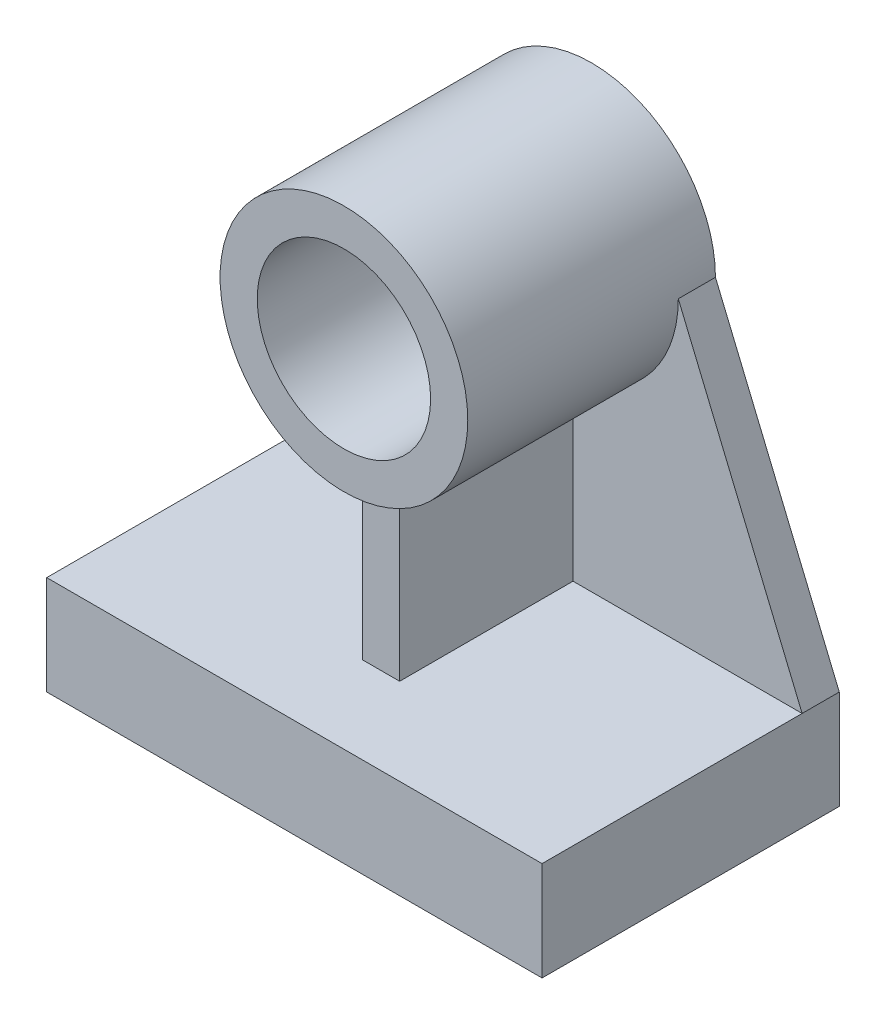
ISO-10303-21;
HEADER;
FILE_DESCRIPTION(('STEP AP214'),'2;1');
FILE_NAME('part.step','',(''),(''),'','','');
FILE_SCHEMA(('AUTOMOTIVE_DESIGN { 1 0 10303 214 1 1 1 1 }'));
ENDSEC;
DATA;
#1=APPLICATION_CONTEXT('core data for automotive mechanical design processes');
#2=APPLICATION_PROTOCOL_DEFINITION('international standard','automotive_design',2000,#1);
#3=PRODUCT_CONTEXT('',#1,'mechanical');
#4=PRODUCT('Part','Part','',(#3));
#5=PRODUCT_RELATED_PRODUCT_CATEGORY('part','',(#4));
#6=PRODUCT_DEFINITION_FORMATION('','',#4);
#7=PRODUCT_DEFINITION_CONTEXT('part definition',#1,'design');
#8=PRODUCT_DEFINITION('design','',#6,#7);
#9=PRODUCT_DEFINITION_SHAPE('','',#8);
#10=(LENGTH_UNIT() NAMED_UNIT(*) SI_UNIT(.MILLI.,.METRE.));
#11=(NAMED_UNIT(*) PLANE_ANGLE_UNIT() SI_UNIT($,.RADIAN.));
#12=(NAMED_UNIT(*) SI_UNIT($,.STERADIAN.) SOLID_ANGLE_UNIT());
#13=UNCERTAINTY_MEASURE_WITH_UNIT(LENGTH_MEASURE(1.E-05),#10,'distance_accuracy_value','');
#14=(GEOMETRIC_REPRESENTATION_CONTEXT(3) GLOBAL_UNCERTAINTY_ASSIGNED_CONTEXT((#13)) GLOBAL_UNIT_ASSIGNED_CONTEXT((#10,
#11,#12)) REPRESENTATION_CONTEXT('',''));
#15=CARTESIAN_POINT('',(0.,0.,0.));
#16=DIRECTION('',(0.,0.,1.));
#17=DIRECTION('',(1.,0.,0.));
#18=AXIS2_PLACEMENT_3D('',#15,#16,#17);
#19=CARTESIAN_POINT('',(-9.525,0.,107.95));
#20=DIRECTION('',(1.,0.,0.));
#21=DIRECTION('',(0.,1.,0.));
#22=AXIS2_PLACEMENT_3D('',#19,#20,#21);
#23=PLANE('',#22);
#24=DIRECTION('',(0.,0.,-1.));
#25=VECTOR('',#24,1.);
#26=CARTESIAN_POINT('',(-9.525,-62.7815607881805,107.95));
#27=LINE('',#26,#25);
#28=CARTESIAN_POINT('',(-9.525,-62.7815607881805,107.95));
#29=VERTEX_POINT('',#28);
#30=CARTESIAN_POINT('',(-9.525,-62.7815607881805,19.05));
#31=VERTEX_POINT('',#30);
#32=EDGE_CURVE('E11',#29,#31,#27,.T.);
#33=ORIENTED_EDGE('',*,*,#32,.T.);
#34=DIRECTION('',(0.,-1.,0.));
#35=VECTOR('',#34,1.);
#36=CARTESIAN_POINT('',(-9.525,0.,19.05));
#37=LINE('',#36,#35);
#38=CARTESIAN_POINT('',(-9.52500000000001,-152.4,19.05));
#39=VERTEX_POINT('',#38);
#40=EDGE_CURVE('E190',#31,#39,#37,.T.);
#41=ORIENTED_EDGE('',*,*,#40,.T.);
#42=DIRECTION('',(0.,0.,-1.));
#43=VECTOR('',#42,1.);
#44=CARTESIAN_POINT('',(-9.52500000000001,-152.4,107.95));
#45=LINE('',#44,#43);
#46=CARTESIAN_POINT('',(-9.52500000000001,-152.4,107.95));
#47=VERTEX_POINT('',#46);
#48=EDGE_CURVE('E53',#47,#39,#45,.T.);
#49=ORIENTED_EDGE('',*,*,#48,.F.);
#50=DIRECTION('',(0.,-1.,0.));
#51=VECTOR('',#50,1.);
#52=CARTESIAN_POINT('',(-9.525,0.,107.95));
#53=LINE('',#52,#51);
#54=EDGE_CURVE('E232',#29,#47,#53,.T.);
#55=ORIENTED_EDGE('',*,*,#54,.F.);
#56=EDGE_LOOP('',(#33,#41,#49,#55));
#57=FACE_BOUND('',#56,.T.);
#58=ADVANCED_FACE('F45',(#57),#23,.F.);
#59=CARTESIAN_POINT('',(9.525,0.,107.95));
#60=DIRECTION('',(1.,0.,0.));
#61=DIRECTION('',(0.,1.,0.));
#62=AXIS2_PLACEMENT_3D('',#59,#60,#61);
#63=PLANE('',#62);
#64=DIRECTION('',(0.,-1.,0.));
#65=VECTOR('',#64,1.);
#66=CARTESIAN_POINT('',(9.525,0.,19.05));
#67=LINE('',#66,#65);
#68=CARTESIAN_POINT('',(9.525,-62.7815607881805,19.05));
#69=VERTEX_POINT('',#68);
#70=CARTESIAN_POINT('',(9.525,-152.4,19.05));
#71=VERTEX_POINT('',#70);
#72=EDGE_CURVE('E67',#69,#71,#67,.T.);
#73=ORIENTED_EDGE('',*,*,#72,.F.);
#74=DIRECTION('',(0.,0.,-1.));
#75=VECTOR('',#74,1.);
#76=CARTESIAN_POINT('',(9.525,-62.7815607881805,107.95));
#77=LINE('',#76,#75);
#78=CARTESIAN_POINT('',(9.525,-62.7815607881805,107.95));
#79=VERTEX_POINT('',#78);
#80=EDGE_CURVE('E244',#79,#69,#77,.T.);
#81=ORIENTED_EDGE('',*,*,#80,.F.);
#82=DIRECTION('',(0.,-1.,0.));
#83=VECTOR('',#82,1.);
#84=CARTESIAN_POINT('',(9.525,0.,107.95));
#85=LINE('',#84,#83);
#86=CARTESIAN_POINT('',(9.525,-152.4,107.95));
#87=VERTEX_POINT('',#86);
#88=EDGE_CURVE('E240',#79,#87,#85,.T.);
#89=ORIENTED_EDGE('',*,*,#88,.T.);
#90=DIRECTION('',(0.,0.,-1.));
#91=VECTOR('',#90,1.);
#92=CARTESIAN_POINT('',(9.525,-152.4,107.95));
#93=LINE('',#92,#91);
#94=EDGE_CURVE('E248',#87,#71,#93,.T.);
#95=ORIENTED_EDGE('',*,*,#94,.T.);
#96=EDGE_LOOP('',(#73,#81,#89,#95));
#97=FACE_BOUND('',#96,.T.);
#98=ADVANCED_FACE('F251',(#97),#63,.T.);
#99=CARTESIAN_POINT('',(0.,0.,107.95));
#100=DIRECTION('',(0.,0.,1.));
#101=DIRECTION('',(1.,0.,0.));
#102=AXIS2_PLACEMENT_3D('',#99,#100,#101);
#103=PLANE('',#102);
#104=CARTESIAN_POINT('',(0.,0.,107.95));
#105=DIRECTION('',(0.,0.,1.));
#106=DIRECTION('',(1.,0.,0.));
#107=AXIS2_PLACEMENT_3D('',#104,#105,#106);
#108=CIRCLE('',#107,63.5);
#109=EDGE_CURVE('E204',#29,#79,#108,.T.);
#110=ORIENTED_EDGE('',*,*,#109,.F.);
#111=ORIENTED_EDGE('',*,*,#54,.T.);
#112=DIRECTION('',(1.,0.,0.));
#113=VECTOR('',#112,1.);
#114=CARTESIAN_POINT('',(0.,-152.4,107.95));
#115=LINE('',#114,#113);
#116=EDGE_CURVE('E236',#47,#87,#115,.T.);
#117=ORIENTED_EDGE('',*,*,#116,.T.);
#118=ORIENTED_EDGE('',*,*,#88,.F.);
#119=EDGE_LOOP('',(#110,#111,#117,#118));
#120=FACE_BOUND('',#119,.T.);
#121=ADVANCED_FACE('F262',(#120),#103,.T.);
#122=CARTESIAN_POINT('',(0.,0.,0.));
#123=DIRECTION('',(0.,0.,1.));
#124=DIRECTION('',(1.,0.,0.));
#125=AXIS2_PLACEMENT_3D('',#122,#123,#124);
#126=PLANE('',#125);
#127=DIRECTION('',(-0.384615384615385,-0.923076923076923,0.));
#128=VECTOR('',#127,1.);
#129=CARTESIAN_POINT('',(-54.1065088757396,22.5443786982249,0.));
#130=LINE('',#129,#128);
#131=CARTESIAN_POINT('',(-63.5,0.,0.));
#132=VERTEX_POINT('',#131);
#133=CARTESIAN_POINT('',(-127.,-152.4,0.));
#134=VERTEX_POINT('',#133);
#135=EDGE_CURVE('E183',#132,#134,#130,.T.);
#136=ORIENTED_EDGE('',*,*,#135,.F.);
#137=CARTESIAN_POINT('',(0.,0.,0.));
#138=DIRECTION('',(0.,0.,1.));
#139=DIRECTION('',(1.,0.,0.));
#140=AXIS2_PLACEMENT_3D('',#137,#138,#139);
#141=CIRCLE('',#140,63.5);
#142=CARTESIAN_POINT('',(63.5,0.,0.));
#143=VERTEX_POINT('',#142);
#144=EDGE_CURVE('E160',#143,#132,#141,.T.);
#145=ORIENTED_EDGE('',*,*,#144,.F.);
#146=DIRECTION('',(0.384615384615385,-0.923076923076923,0.));
#147=VECTOR('',#146,1.);
#148=CARTESIAN_POINT('',(54.1065088757396,22.5443786982249,0.));
#149=LINE('',#148,#147);
#150=CARTESIAN_POINT('',(127.,-152.4,0.));
#151=VERTEX_POINT('',#150);
#152=EDGE_CURVE('E173',#143,#151,#149,.T.);
#153=ORIENTED_EDGE('',*,*,#152,.T.);
#154=DIRECTION('',(0.,1.,0.));
#155=VECTOR('',#154,1.);
#156=CARTESIAN_POINT('',(127.,0.,0.));
#157=LINE('',#156,#155);
#158=CARTESIAN_POINT('',(127.,-203.2,0.));
#159=VERTEX_POINT('',#158);
#160=EDGE_CURVE('E299',#159,#151,#157,.T.);
#161=ORIENTED_EDGE('',*,*,#160,.F.);
#162=DIRECTION('',(1.,0.,0.));
#163=VECTOR('',#162,1.);
#164=CARTESIAN_POINT('',(0.,-203.2,0.));
#165=LINE('',#164,#163);
#166=CARTESIAN_POINT('',(-127.,-203.2,0.));
#167=VERTEX_POINT('',#166);
#168=EDGE_CURVE('E153',#167,#159,#165,.T.);
#169=ORIENTED_EDGE('',*,*,#168,.F.);
#170=DIRECTION('',(0.,1.,0.));
#171=VECTOR('',#170,1.);
#172=CARTESIAN_POINT('',(-127.,0.,0.));
#173=LINE('',#172,#171);
#174=EDGE_CURVE('E149',#167,#134,#173,.T.);
#175=ORIENTED_EDGE('',*,*,#174,.T.);
#176=EDGE_LOOP('',(#136,#145,#153,#161,#169,#175));
#177=FACE_BOUND('',#176,.T.);
#178=CARTESIAN_POINT('',(0.,0.,0.));
#179=DIRECTION('',(0.,0.,1.));
#180=DIRECTION('',(1.,0.,0.));
#181=AXIS2_PLACEMENT_3D('',#178,#179,#180);
#182=CIRCLE('',#181,44.45);
#183=CARTESIAN_POINT('',(44.45,0.,0.));
#184=VERTEX_POINT('',#183);
#185=EDGE_CURVE('E155',#184,#184,#182,.T.);
#186=ORIENTED_EDGE('',*,*,#185,.T.);
#187=EDGE_LOOP('',(#186));
#188=FACE_BOUND('',#187,.T.);
#189=ADVANCED_FACE('F294',(#177,#188),#126,.F.);
#190=CARTESIAN_POINT('',(54.1065088757396,22.5443786982249,19.05));
#191=DIRECTION('',(0.923076923076923,0.384615384615385,0.));
#192=DIRECTION('',(-0.384615384615385,0.923076923076923,0.));
#193=AXIS2_PLACEMENT_3D('',#190,#191,#192);
#194=PLANE('',#193);
#195=ORIENTED_EDGE('',*,*,#152,.F.);
#196=DIRECTION('',(0.,0.,-1.));
#197=VECTOR('',#196,1.);
#198=CARTESIAN_POINT('',(63.5,0.,19.05));
#199=LINE('',#198,#197);
#200=CARTESIAN_POINT('',(63.5,0.,19.05));
#201=VERTEX_POINT('',#200);
#202=EDGE_CURVE('E219',#201,#143,#199,.T.);
#203=ORIENTED_EDGE('',*,*,#202,.F.);
#204=DIRECTION('',(0.384615384615385,-0.923076923076923,0.));
#205=VECTOR('',#204,1.);
#206=CARTESIAN_POINT('',(54.1065088757396,22.5443786982249,19.05));
#207=LINE('',#206,#205);
#208=CARTESIAN_POINT('',(127.,-152.4,19.0500000000001));
#209=VERTEX_POINT('',#208);
#210=EDGE_CURVE('E215',#201,#209,#207,.T.);
#211=ORIENTED_EDGE('',*,*,#210,.T.);
#212=DIRECTION('',(0.,0.,-1.));
#213=VECTOR('',#212,1.);
#214=CARTESIAN_POINT('',(127.,-152.4,19.05));
#215=LINE('',#214,#213);
#216=EDGE_CURVE('E198',#209,#151,#215,.T.);
#217=ORIENTED_EDGE('',*,*,#216,.T.);
#218=EDGE_LOOP('',(#195,#203,#211,#217));
#219=FACE_BOUND('',#218,.T.);
#220=ADVANCED_FACE('F335',(#219),#194,.T.);
#221=CARTESIAN_POINT('',(0.,0.,19.05));
#222=DIRECTION('',(0.,0.,1.));
#223=DIRECTION('',(1.,0.,0.));
#224=AXIS2_PLACEMENT_3D('',#221,#222,#223);
#225=PLANE('',#224);
#226=CARTESIAN_POINT('',(0.,0.,19.05));
#227=DIRECTION('',(0.,0.,1.));
#228=DIRECTION('',(1.,0.,0.));
#229=AXIS2_PLACEMENT_3D('',#226,#227,#228);
#230=CIRCLE('',#229,63.5);
#231=EDGE_CURVE('E205',#69,#201,#230,.T.);
#232=ORIENTED_EDGE('',*,*,#231,.F.);
#233=ORIENTED_EDGE('',*,*,#72,.T.);
#234=DIRECTION('',(1.,0.,0.));
#235=VECTOR('',#234,1.);
#236=CARTESIAN_POINT('',(0.,-152.4,19.05));
#237=LINE('',#236,#235);
#238=EDGE_CURVE('E211',#71,#209,#237,.T.);
#239=ORIENTED_EDGE('',*,*,#238,.T.);
#240=ORIENTED_EDGE('',*,*,#210,.F.);
#241=EDGE_LOOP('',(#232,#233,#239,#240));
#242=FACE_BOUND('',#241,.T.);
#243=ADVANCED_FACE('F254',(#242),#225,.T.);
#244=CARTESIAN_POINT('',(-54.1065088757396,22.5443786982249,19.05));
#245=DIRECTION('',(0.923076923076923,-0.384615384615385,0.));
#246=DIRECTION('',(0.384615384615385,0.923076923076923,0.));
#247=AXIS2_PLACEMENT_3D('',#244,#245,#246);
#248=PLANE('',#247);
#249=ORIENTED_EDGE('',*,*,#135,.T.);
#250=DIRECTION('',(0.,0.,-1.));
#251=VECTOR('',#250,1.);
#252=CARTESIAN_POINT('',(-127.,-152.4,19.05));
#253=LINE('',#252,#251);
#254=CARTESIAN_POINT('',(-127.,-152.4,19.05));
#255=VERTEX_POINT('',#254);
#256=EDGE_CURVE('E194',#255,#134,#253,.T.);
#257=ORIENTED_EDGE('',*,*,#256,.F.);
#258=DIRECTION('',(-0.384615384615385,-0.923076923076923,0.));
#259=VECTOR('',#258,1.);
#260=CARTESIAN_POINT('',(-54.1065088757396,22.5443786982249,19.05));
#261=LINE('',#260,#259);
#262=CARTESIAN_POINT('',(-63.5,0.,19.05));
#263=VERTEX_POINT('',#262);
#264=EDGE_CURVE('E182',#263,#255,#261,.T.);
#265=ORIENTED_EDGE('',*,*,#264,.F.);
#266=DIRECTION('',(0.,0.,-1.));
#267=VECTOR('',#266,1.);
#268=CARTESIAN_POINT('',(-63.5,0.,19.05));
#269=LINE('',#268,#267);
#270=EDGE_CURVE('E201',#263,#132,#269,.T.);
#271=ORIENTED_EDGE('',*,*,#270,.T.);
#272=EDGE_LOOP('',(#249,#257,#265,#271));
#273=FACE_BOUND('',#272,.T.);
#274=ADVANCED_FACE('F290',(#273),#248,.F.);
#275=CARTESIAN_POINT('',(0.,0.,19.05));
#276=DIRECTION('',(0.,0.,1.));
#277=DIRECTION('',(1.,0.,0.));
#278=AXIS2_PLACEMENT_3D('',#275,#276,#277);
#279=PLANE('',#278);
#280=CARTESIAN_POINT('',(0.,0.,19.05));
#281=DIRECTION('',(0.,0.,1.));
#282=DIRECTION('',(1.,0.,0.));
#283=AXIS2_PLACEMENT_3D('',#280,#281,#282);
#284=CIRCLE('',#283,63.5);
#285=EDGE_CURVE('E178',#263,#31,#284,.T.);
#286=ORIENTED_EDGE('',*,*,#285,.F.);
#287=ORIENTED_EDGE('',*,*,#264,.T.);
#288=DIRECTION('',(1.,0.,0.));
#289=VECTOR('',#288,1.);
#290=CARTESIAN_POINT('',(0.,-152.4,19.05));
#291=LINE('',#290,#289);
#292=EDGE_CURVE('E187',#255,#39,#291,.T.);
#293=ORIENTED_EDGE('',*,*,#292,.T.);
#294=ORIENTED_EDGE('',*,*,#40,.F.);
#295=EDGE_LOOP('',(#286,#287,#293,#294));
#296=FACE_BOUND('',#295,.T.);
#297=ADVANCED_FACE('F285',(#296),#279,.T.);
#298=CARTESIAN_POINT('',(0.,0.,127.));
#299=DIRECTION('',(0.,0.,-1.));
#300=DIRECTION('',(-1.,0.,0.));
#301=AXIS2_PLACEMENT_3D('',#298,#299,#300);
#302=CYLINDRICAL_SURFACE('',#301,44.45);
#303=CARTESIAN_POINT('',(0.,0.,127.));
#304=DIRECTION('',(0.,0.,1.));
#305=DIRECTION('',(1.,0.,0.));
#306=AXIS2_PLACEMENT_3D('',#303,#304,#305);
#307=CIRCLE('',#306,44.45);
#308=CARTESIAN_POINT('',(44.45,0.,127.));
#309=VERTEX_POINT('',#308);
#310=EDGE_CURVE('E166',#309,#309,#307,.T.);
#311=ORIENTED_EDGE('',*,*,#310,.T.);
#312=EDGE_LOOP('',(#311));
#313=FACE_BOUND('',#312,.T.);
#314=ORIENTED_EDGE('',*,*,#185,.F.);
#315=EDGE_LOOP('',(#314));
#316=FACE_BOUND('',#315,.T.);
#317=ADVANCED_FACE('F326',(#313,#316),#302,.F.);
#318=CARTESIAN_POINT('',(0.,0.,127.));
#319=DIRECTION('',(0.,0.,-1.));
#320=DIRECTION('',(-1.,0.,0.));
#321=AXIS2_PLACEMENT_3D('',#318,#319,#320);
#322=CYLINDRICAL_SURFACE('',#321,63.5);
#323=ORIENTED_EDGE('',*,*,#202,.T.);
#324=ORIENTED_EDGE('',*,*,#144,.T.);
#325=ORIENTED_EDGE('',*,*,#270,.F.);
#326=ORIENTED_EDGE('',*,*,#285,.T.);
#327=ORIENTED_EDGE('',*,*,#32,.F.);
#328=ORIENTED_EDGE('',*,*,#109,.T.);
#329=ORIENTED_EDGE('',*,*,#80,.T.);
#330=ORIENTED_EDGE('',*,*,#231,.T.);
#331=EDGE_LOOP('',(#323,#324,#325,#326,#327,#328,#329,#330));
#332=FACE_BOUND('',#331,.T.);
#333=CARTESIAN_POINT('',(0.,0.,127.));
#334=DIRECTION('',(0.,0.,1.));
#335=DIRECTION('',(1.,0.,0.));
#336=AXIS2_PLACEMENT_3D('',#333,#334,#335);
#337=CIRCLE('',#336,63.5);
#338=CARTESIAN_POINT('',(63.5,0.,127.));
#339=VERTEX_POINT('',#338);
#340=EDGE_CURVE('E170',#339,#339,#337,.T.);
#341=ORIENTED_EDGE('',*,*,#340,.F.);
#342=EDGE_LOOP('',(#341));
#343=FACE_BOUND('',#342,.T.);
#344=ADVANCED_FACE('F257',(#332,#343),#322,.T.);
#345=CARTESIAN_POINT('',(0.,0.,127.));
#346=DIRECTION('',(0.,0.,1.));
#347=DIRECTION('',(1.,0.,0.));
#348=AXIS2_PLACEMENT_3D('',#345,#346,#347);
#349=PLANE('',#348);
#350=ORIENTED_EDGE('',*,*,#310,.F.);
#351=EDGE_LOOP('',(#350));
#352=FACE_BOUND('',#351,.T.);
#353=ORIENTED_EDGE('',*,*,#340,.T.);
#354=EDGE_LOOP('',(#353));
#355=FACE_BOUND('',#354,.T.);
#356=ADVANCED_FACE('F265',(#352,#355),#349,.T.);
#357=CARTESIAN_POINT('',(0.,-152.4,152.4));
#358=DIRECTION('',(0.,1.,0.));
#359=DIRECTION('',(0.,0.,1.));
#360=AXIS2_PLACEMENT_3D('',#357,#358,#359);
#361=PLANE('',#360);
#362=ORIENTED_EDGE('',*,*,#238,.F.);
#363=ORIENTED_EDGE('',*,*,#94,.F.);
#364=ORIENTED_EDGE('',*,*,#116,.F.);
#365=ORIENTED_EDGE('',*,*,#48,.T.);
#366=ORIENTED_EDGE('',*,*,#292,.F.);
#367=DIRECTION('',(0.,0.,-1.));
#368=VECTOR('',#367,1.);
#369=CARTESIAN_POINT('',(-127.,-152.4,152.4));
#370=LINE('',#369,#368);
#371=CARTESIAN_POINT('',(-127.,-152.4,152.4));
#372=VERTEX_POINT('',#371);
#373=EDGE_CURVE('E162',#372,#255,#370,.T.);
#374=ORIENTED_EDGE('',*,*,#373,.F.);
#375=DIRECTION('',(1.,0.,0.));
#376=VECTOR('',#375,1.);
#377=CARTESIAN_POINT('',(0.,-152.4,152.4));
#378=LINE('',#377,#376);
#379=CARTESIAN_POINT('',(127.,-152.4,152.4));
#380=VERTEX_POINT('',#379);
#381=EDGE_CURVE('E139',#372,#380,#378,.T.);
#382=ORIENTED_EDGE('',*,*,#381,.T.);
#383=DIRECTION('',(0.,0.,-1.));
#384=VECTOR('',#383,1.);
#385=CARTESIAN_POINT('',(127.,-152.4,152.4));
#386=LINE('',#385,#384);
#387=EDGE_CURVE('E134',#380,#209,#386,.T.);
#388=ORIENTED_EDGE('',*,*,#387,.T.);
#389=EDGE_LOOP('',(#362,#363,#364,#365,#366,#374,#382,#388));
#390=FACE_BOUND('',#389,.T.);
#391=ADVANCED_FACE('F263',(#390),#361,.T.);
#392=CARTESIAN_POINT('',(0.,-203.2,152.4));
#393=DIRECTION('',(0.,1.,0.));
#394=DIRECTION('',(0.,0.,1.));
#395=AXIS2_PLACEMENT_3D('',#392,#393,#394);
#396=PLANE('',#395);
#397=ORIENTED_EDGE('',*,*,#168,.T.);
#398=DIRECTION('',(0.,0.,-1.));
#399=VECTOR('',#398,1.);
#400=CARTESIAN_POINT('',(127.,-203.2,152.4));
#401=LINE('',#400,#399);
#402=CARTESIAN_POINT('',(127.,-203.2,152.4));
#403=VERTEX_POINT('',#402);
#404=EDGE_CURVE('E131',#403,#159,#401,.T.);
#405=ORIENTED_EDGE('',*,*,#404,.F.);
#406=DIRECTION('',(1.,0.,0.));
#407=VECTOR('',#406,1.);
#408=CARTESIAN_POINT('',(0.,-203.2,152.4));
#409=LINE('',#408,#407);
#410=CARTESIAN_POINT('',(-127.,-203.2,152.4));
#411=VERTEX_POINT('',#410);
#412=EDGE_CURVE('E140',#411,#403,#409,.T.);
#413=ORIENTED_EDGE('',*,*,#412,.F.);
#414=DIRECTION('',(0.,0.,-1.));
#415=VECTOR('',#414,1.);
#416=CARTESIAN_POINT('',(-127.,-203.2,152.4));
#417=LINE('',#416,#415);
#418=EDGE_CURVE('E305',#411,#167,#417,.T.);
#419=ORIENTED_EDGE('',*,*,#418,.T.);
#420=EDGE_LOOP('',(#397,#405,#413,#419));
#421=FACE_BOUND('',#420,.T.);
#422=ADVANCED_FACE('F151',(#421),#396,.F.);
#423=CARTESIAN_POINT('',(127.,0.,152.4));
#424=DIRECTION('',(-1.,0.,0.));
#425=DIRECTION('',(0.,0.,1.));
#426=AXIS2_PLACEMENT_3D('',#423,#424,#425);
#427=PLANE('',#426);
#428=ORIENTED_EDGE('',*,*,#160,.T.);
#429=ORIENTED_EDGE('',*,*,#216,.F.);
#430=ORIENTED_EDGE('',*,*,#387,.F.);
#431=DIRECTION('',(0.,1.,0.));
#432=VECTOR('',#431,1.);
#433=CARTESIAN_POINT('',(127.,0.,152.4));
#434=LINE('',#433,#432);
#435=EDGE_CURVE('E127',#403,#380,#434,.T.);
#436=ORIENTED_EDGE('',*,*,#435,.F.);
#437=ORIENTED_EDGE('',*,*,#404,.T.);
#438=EDGE_LOOP('',(#428,#429,#430,#436,#437));
#439=FACE_BOUND('',#438,.T.);
#440=ADVANCED_FACE('F129',(#439),#427,.F.);
#441=CARTESIAN_POINT('',(-127.,0.,152.4));
#442=DIRECTION('',(-1.,0.,0.));
#443=DIRECTION('',(0.,0.,1.));
#444=AXIS2_PLACEMENT_3D('',#441,#442,#443);
#445=PLANE('',#444);
#446=ORIENTED_EDGE('',*,*,#174,.F.);
#447=ORIENTED_EDGE('',*,*,#418,.F.);
#448=DIRECTION('',(0.,1.,0.));
#449=VECTOR('',#448,1.);
#450=CARTESIAN_POINT('',(-127.,0.,152.4));
#451=LINE('',#450,#449);
#452=EDGE_CURVE('E146',#411,#372,#451,.T.);
#453=ORIENTED_EDGE('',*,*,#452,.T.);
#454=ORIENTED_EDGE('',*,*,#373,.T.);
#455=ORIENTED_EDGE('',*,*,#256,.T.);
#456=EDGE_LOOP('',(#446,#447,#453,#454,#455));
#457=FACE_BOUND('',#456,.T.);
#458=ADVANCED_FACE('F309',(#457),#445,.T.);
#459=CARTESIAN_POINT('',(0.,0.,152.4));
#460=DIRECTION('',(0.,0.,1.));
#461=DIRECTION('',(1.,0.,0.));
#462=AXIS2_PLACEMENT_3D('',#459,#460,#461);
#463=PLANE('',#462);
#464=ORIENTED_EDGE('',*,*,#412,.T.);
#465=ORIENTED_EDGE('',*,*,#435,.T.);
#466=ORIENTED_EDGE('',*,*,#381,.F.);
#467=ORIENTED_EDGE('',*,*,#452,.F.);
#468=EDGE_LOOP('',(#464,#465,#466,#467));
#469=FACE_BOUND('',#468,.T.);
#470=ADVANCED_FACE('F144',(#469),#463,.T.);
#471=CLOSED_SHELL('',(#58,#98,#121,#189,#220,#243,#274,#297,#317,#344,#356,#391,#422,#440,#458,#470));
#472=MANIFOLD_SOLID_BREP('B2',#471);
#473=ADVANCED_BREP_SHAPE_REPRESENTATION('',(#18,#472),#14);
#474=SHAPE_DEFINITION_REPRESENTATION(#9,#473);
ENDSEC;
END-ISO-10303-21;
